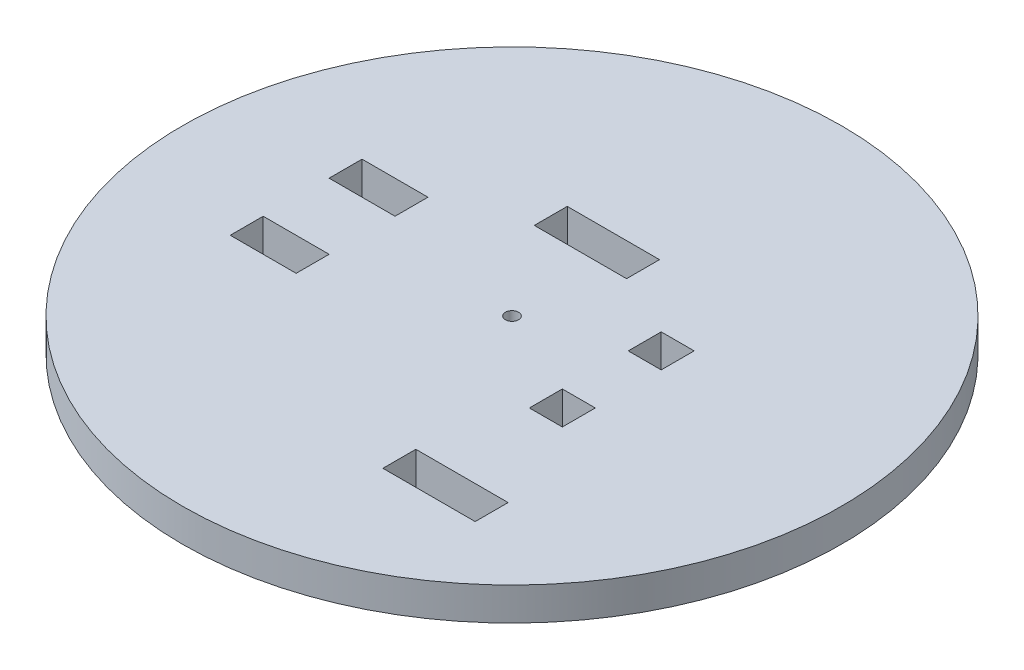
ISO-10303-21;
HEADER;
FILE_DESCRIPTION(('STEP AP214'),'2;1');
FILE_NAME('part.step','',(''),(''),'','','');
FILE_SCHEMA(('AUTOMOTIVE_DESIGN { 1 0 10303 214 1 1 1 1 }'));
ENDSEC;
DATA;
#1=APPLICATION_CONTEXT('core data for automotive mechanical design processes');
#2=APPLICATION_PROTOCOL_DEFINITION('international standard','automotive_design',2000,#1);
#3=PRODUCT_CONTEXT('',#1,'mechanical');
#4=PRODUCT('Part','Part','',(#3));
#5=PRODUCT_RELATED_PRODUCT_CATEGORY('part','',(#4));
#6=PRODUCT_DEFINITION_FORMATION('','',#4);
#7=PRODUCT_DEFINITION_CONTEXT('part definition',#1,'design');
#8=PRODUCT_DEFINITION('design','',#6,#7);
#9=PRODUCT_DEFINITION_SHAPE('','',#8);
#10=(LENGTH_UNIT() NAMED_UNIT(*) SI_UNIT(.MILLI.,.METRE.));
#11=(NAMED_UNIT(*) PLANE_ANGLE_UNIT() SI_UNIT($,.RADIAN.));
#12=(NAMED_UNIT(*) SI_UNIT($,.STERADIAN.) SOLID_ANGLE_UNIT());
#13=UNCERTAINTY_MEASURE_WITH_UNIT(LENGTH_MEASURE(1.E-05),#10,'distance_accuracy_value','');
#14=(GEOMETRIC_REPRESENTATION_CONTEXT(3) GLOBAL_UNCERTAINTY_ASSIGNED_CONTEXT((#13)) GLOBAL_UNIT_ASSIGNED_CONTEXT((#10,
#11,#12)) REPRESENTATION_CONTEXT('',''));
#15=CARTESIAN_POINT('',(0.,0.,0.));
#16=DIRECTION('',(0.,0.,1.));
#17=DIRECTION('',(1.,0.,0.));
#18=AXIS2_PLACEMENT_3D('',#15,#16,#17);
#19=CARTESIAN_POINT('',(-40.612799332742,6.35,0.));
#20=DIRECTION('',(-1.,0.,0.));
#21=DIRECTION('',(0.,0.,1.));
#22=AXIS2_PLACEMENT_3D('',#19,#20,#21);
#23=PLANE('',#22);
#24=DIRECTION('',(0.,0.,-1.));
#25=VECTOR('',#24,1.);
#26=CARTESIAN_POINT('',(-40.612799332742,0.,0.));
#27=LINE('',#26,#25);
#28=CARTESIAN_POINT('',(-40.612799332742,0.,13.6765770064407));
#29=VERTEX_POINT('',#28);
#30=CARTESIAN_POINT('',(-40.612799332742,0.,7.3265770064407));
#31=VERTEX_POINT('',#30);
#32=EDGE_CURVE('E292',#29,#31,#27,.T.);
#33=ORIENTED_EDGE('',*,*,#32,.T.);
#34=DIRECTION('',(0.,-1.,0.));
#35=VECTOR('',#34,1.);
#36=CARTESIAN_POINT('',(-40.612799332742,6.35,7.3265770064407));
#37=LINE('',#36,#35);
#38=CARTESIAN_POINT('',(-40.612799332742,6.35,7.3265770064407));
#39=VERTEX_POINT('',#38);
#40=EDGE_CURVE('E11',#39,#31,#37,.T.);
#41=ORIENTED_EDGE('',*,*,#40,.F.);
#42=DIRECTION('',(0.,0.,-1.));
#43=VECTOR('',#42,1.);
#44=CARTESIAN_POINT('',(-40.612799332742,6.35,0.));
#45=LINE('',#44,#43);
#46=CARTESIAN_POINT('',(-40.612799332742,6.35,13.6765770064407));
#47=VERTEX_POINT('',#46);
#48=EDGE_CURVE('E212',#47,#39,#45,.T.);
#49=ORIENTED_EDGE('',*,*,#48,.F.);
#50=DIRECTION('',(0.,-1.,0.));
#51=VECTOR('',#50,1.);
#52=CARTESIAN_POINT('',(-40.612799332742,6.35,13.6765770064407));
#53=LINE('',#52,#51);
#54=EDGE_CURVE('E54',#47,#29,#53,.T.);
#55=ORIENTED_EDGE('',*,*,#54,.T.);
#56=EDGE_LOOP('',(#33,#41,#49,#55));
#57=FACE_BOUND('',#56,.T.);
#58=ADVANCED_FACE('F35',(#57),#23,.F.);
#59=CARTESIAN_POINT('',(0.,6.35,7.3265770064407));
#60=DIRECTION('',(0.,0.,-1.));
#61=DIRECTION('',(-1.,0.,0.));
#62=AXIS2_PLACEMENT_3D('',#59,#60,#61);
#63=PLANE('',#62);
#64=DIRECTION('',(1.,0.,0.));
#65=VECTOR('',#64,1.);
#66=CARTESIAN_POINT('',(0.,0.,7.3265770064407));
#67=LINE('',#66,#65);
#68=CARTESIAN_POINT('',(-27.9127993327419,0.,7.3265770064407));
#69=VERTEX_POINT('',#68);
#70=EDGE_CURVE('E218',#31,#69,#67,.T.);
#71=ORIENTED_EDGE('',*,*,#70,.T.);
#72=DIRECTION('',(0.,-1.,0.));
#73=VECTOR('',#72,1.);
#74=CARTESIAN_POINT('',(-27.9127993327419,6.35,7.3265770064407));
#75=LINE('',#74,#73);
#76=CARTESIAN_POINT('',(-27.9127993327419,6.35,7.3265770064407));
#77=VERTEX_POINT('',#76);
#78=EDGE_CURVE('E45',#77,#69,#75,.T.);
#79=ORIENTED_EDGE('',*,*,#78,.F.);
#80=DIRECTION('',(1.,0.,0.));
#81=VECTOR('',#80,1.);
#82=CARTESIAN_POINT('',(0.,6.35,7.3265770064407));
#83=LINE('',#82,#81);
#84=EDGE_CURVE('E205',#39,#77,#83,.T.);
#85=ORIENTED_EDGE('',*,*,#84,.F.);
#86=ORIENTED_EDGE('',*,*,#40,.T.);
#87=EDGE_LOOP('',(#71,#79,#85,#86));
#88=FACE_BOUND('',#87,.T.);
#89=ADVANCED_FACE('F217',(#88),#63,.F.);
#90=CARTESIAN_POINT('',(-27.9127993327419,6.35,0.));
#91=DIRECTION('',(1.,0.,0.));
#92=DIRECTION('',(0.,0.,-1.));
#93=AXIS2_PLACEMENT_3D('',#90,#91,#92);
#94=PLANE('',#93);
#95=DIRECTION('',(0.,0.,1.));
#96=VECTOR('',#95,1.);
#97=CARTESIAN_POINT('',(-27.9127993327419,0.,0.));
#98=LINE('',#97,#96);
#99=CARTESIAN_POINT('',(-27.9127993327419,0.,13.6765770064407));
#100=VERTEX_POINT('',#99);
#101=EDGE_CURVE('E295',#69,#100,#98,.T.);
#102=ORIENTED_EDGE('',*,*,#101,.T.);
#103=DIRECTION('',(0.,-1.,0.));
#104=VECTOR('',#103,1.);
#105=CARTESIAN_POINT('',(-27.9127993327419,6.35,13.6765770064407));
#106=LINE('',#105,#104);
#107=CARTESIAN_POINT('',(-27.9127993327419,6.35,13.6765770064407));
#108=VERTEX_POINT('',#107);
#109=EDGE_CURVE('E129',#108,#100,#106,.T.);
#110=ORIENTED_EDGE('',*,*,#109,.F.);
#111=DIRECTION('',(0.,0.,1.));
#112=VECTOR('',#111,1.);
#113=CARTESIAN_POINT('',(-27.9127993327419,6.35,0.));
#114=LINE('',#113,#112);
#115=EDGE_CURVE('E211',#77,#108,#114,.T.);
#116=ORIENTED_EDGE('',*,*,#115,.F.);
#117=ORIENTED_EDGE('',*,*,#78,.T.);
#118=EDGE_LOOP('',(#102,#110,#116,#117));
#119=FACE_BOUND('',#118,.T.);
#120=ADVANCED_FACE('F222',(#119),#94,.F.);
#121=CARTESIAN_POINT('',(0.,6.35,-23.6123745140754));
#122=DIRECTION('',(0.,0.,-1.));
#123=DIRECTION('',(-1.,0.,0.));
#124=AXIS2_PLACEMENT_3D('',#121,#122,#123);
#125=PLANE('',#124);
#126=DIRECTION('',(1.,0.,0.));
#127=VECTOR('',#126,1.);
#128=CARTESIAN_POINT('',(0.,0.,-23.6123745140754));
#129=LINE('',#128,#127);
#130=CARTESIAN_POINT('',(-12.9663344216766,0.,-23.6123745140754));
#131=VERTEX_POINT('',#130);
#132=CARTESIAN_POINT('',(4.81366557832339,0.,-23.6123745140754));
#133=VERTEX_POINT('',#132);
#134=EDGE_CURVE('E280',#131,#133,#129,.T.);
#135=ORIENTED_EDGE('',*,*,#134,.T.);
#136=DIRECTION('',(0.,-1.,0.));
#137=VECTOR('',#136,1.);
#138=CARTESIAN_POINT('',(4.81366557832339,6.35,-23.6123745140754));
#139=LINE('',#138,#137);
#140=CARTESIAN_POINT('',(4.81366557832339,6.35,-23.6123745140754));
#141=VERTEX_POINT('',#140);
#142=EDGE_CURVE('E305',#141,#133,#139,.T.);
#143=ORIENTED_EDGE('',*,*,#142,.F.);
#144=DIRECTION('',(1.,0.,0.));
#145=VECTOR('',#144,1.);
#146=CARTESIAN_POINT('',(0.,6.35,-23.6123745140754));
#147=LINE('',#146,#145);
#148=CARTESIAN_POINT('',(-12.9663344216766,6.35,-23.6123745140754));
#149=VERTEX_POINT('',#148);
#150=EDGE_CURVE('E667',#149,#141,#147,.T.);
#151=ORIENTED_EDGE('',*,*,#150,.F.);
#152=DIRECTION('',(0.,-1.,0.));
#153=VECTOR('',#152,1.);
#154=CARTESIAN_POINT('',(-12.9663344216766,6.35,-23.6123745140754));
#155=LINE('',#154,#153);
#156=EDGE_CURVE('E307',#149,#131,#155,.T.);
#157=ORIENTED_EDGE('',*,*,#156,.T.);
#158=EDGE_LOOP('',(#135,#143,#151,#157));
#159=FACE_BOUND('',#158,.T.);
#160=ADVANCED_FACE('F400',(#159),#125,.F.);
#161=CARTESIAN_POINT('',(4.81366557832339,6.35,0.));
#162=DIRECTION('',(1.,0.,0.));
#163=DIRECTION('',(0.,0.,-1.));
#164=AXIS2_PLACEMENT_3D('',#161,#162,#163);
#165=PLANE('',#164);
#166=DIRECTION('',(0.,0.,1.));
#167=VECTOR('',#166,1.);
#168=CARTESIAN_POINT('',(4.81366557832339,0.,0.));
#169=LINE('',#168,#167);
#170=CARTESIAN_POINT('',(4.81366557832339,0.,-17.2623745140754));
#171=VERTEX_POINT('',#170);
#172=EDGE_CURVE('E283',#133,#171,#169,.T.);
#173=ORIENTED_EDGE('',*,*,#172,.T.);
#174=DIRECTION('',(0.,-1.,0.));
#175=VECTOR('',#174,1.);
#176=CARTESIAN_POINT('',(4.81366557832339,6.35,-17.2623745140754));
#177=LINE('',#176,#175);
#178=CARTESIAN_POINT('',(4.81366557832339,6.35,-17.2623745140754));
#179=VERTEX_POINT('',#178);
#180=EDGE_CURVE('E312',#179,#171,#177,.T.);
#181=ORIENTED_EDGE('',*,*,#180,.F.);
#182=DIRECTION('',(0.,0.,1.));
#183=VECTOR('',#182,1.);
#184=CARTESIAN_POINT('',(4.81366557832339,6.35,0.));
#185=LINE('',#184,#183);
#186=EDGE_CURVE('E670',#141,#179,#185,.T.);
#187=ORIENTED_EDGE('',*,*,#186,.F.);
#188=ORIENTED_EDGE('',*,*,#142,.T.);
#189=EDGE_LOOP('',(#173,#181,#187,#188));
#190=FACE_BOUND('',#189,.T.);
#191=ADVANCED_FACE('F396',(#190),#165,.F.);
#192=CARTESIAN_POINT('',(0.,6.35,-17.2623745140754));
#193=DIRECTION('',(0.,0.,-1.));
#194=DIRECTION('',(-1.,0.,0.));
#195=AXIS2_PLACEMENT_3D('',#192,#193,#194);
#196=PLANE('',#195);
#197=DIRECTION('',(1.,0.,0.));
#198=VECTOR('',#197,1.);
#199=CARTESIAN_POINT('',(0.,0.,-17.2623745140754));
#200=LINE('',#199,#198);
#201=CARTESIAN_POINT('',(-12.9663344216766,0.,-17.2623745140754));
#202=VERTEX_POINT('',#201);
#203=EDGE_CURVE('E286',#202,#171,#200,.T.);
#204=ORIENTED_EDGE('',*,*,#203,.F.);
#205=DIRECTION('',(0.,-1.,0.));
#206=VECTOR('',#205,1.);
#207=CARTESIAN_POINT('',(-12.9663344216766,6.35,-17.2623745140754));
#208=LINE('',#207,#206);
#209=CARTESIAN_POINT('',(-12.9663344216766,6.35,-17.2623745140754));
#210=VERTEX_POINT('',#209);
#211=EDGE_CURVE('E309',#210,#202,#208,.T.);
#212=ORIENTED_EDGE('',*,*,#211,.F.);
#213=DIRECTION('',(1.,0.,0.));
#214=VECTOR('',#213,1.);
#215=CARTESIAN_POINT('',(0.,6.35,-17.2623745140754));
#216=LINE('',#215,#214);
#217=EDGE_CURVE('E678',#210,#179,#216,.T.);
#218=ORIENTED_EDGE('',*,*,#217,.T.);
#219=ORIENTED_EDGE('',*,*,#180,.T.);
#220=EDGE_LOOP('',(#204,#212,#218,#219));
#221=FACE_BOUND('',#220,.T.);
#222=ADVANCED_FACE('F392',(#221),#196,.T.);
#223=CARTESIAN_POINT('',(0.,6.35,-11.7234229935593));
#224=DIRECTION('',(0.,0.,1.));
#225=DIRECTION('',(1.,0.,0.));
#226=AXIS2_PLACEMENT_3D('',#223,#224,#225);
#227=PLANE('',#226);
#228=DIRECTION('',(-1.,0.,0.));
#229=VECTOR('',#228,1.);
#230=CARTESIAN_POINT('',(0.,0.,-11.7234229935593));
#231=LINE('',#230,#229);
#232=CARTESIAN_POINT('',(23.3754891704784,0.,-11.7234229935593));
#233=VERTEX_POINT('',#232);
#234=CARTESIAN_POINT('',(17.0254891704784,0.,-11.7234229935593));
#235=VERTEX_POINT('',#234);
#236=EDGE_CURVE('E268',#233,#235,#231,.T.);
#237=ORIENTED_EDGE('',*,*,#236,.F.);
#238=DIRECTION('',(0.,-1.,0.));
#239=VECTOR('',#238,1.);
#240=CARTESIAN_POINT('',(23.3754891704784,6.35,-11.7234229935593));
#241=LINE('',#240,#239);
#242=CARTESIAN_POINT('',(23.3754891704784,6.35,-11.7234229935593));
#243=VERTEX_POINT('',#242);
#244=EDGE_CURVE('E310',#243,#233,#241,.T.);
#245=ORIENTED_EDGE('',*,*,#244,.F.);
#246=DIRECTION('',(-1.,0.,0.));
#247=VECTOR('',#246,1.);
#248=CARTESIAN_POINT('',(0.,6.35,-11.7234229935593));
#249=LINE('',#248,#247);
#250=CARTESIAN_POINT('',(17.0254891704784,6.35,-11.7234229935593));
#251=VERTEX_POINT('',#250);
#252=EDGE_CURVE('E663',#243,#251,#249,.T.);
#253=ORIENTED_EDGE('',*,*,#252,.T.);
#254=DIRECTION('',(0.,-1.,0.));
#255=VECTOR('',#254,1.);
#256=CARTESIAN_POINT('',(17.0254891704784,6.35,-11.7234229935593));
#257=LINE('',#256,#255);
#258=EDGE_CURVE('E316',#251,#235,#257,.T.);
#259=ORIENTED_EDGE('',*,*,#258,.T.);
#260=EDGE_LOOP('',(#237,#245,#253,#259));
#261=FACE_BOUND('',#260,.T.);
#262=ADVANCED_FACE('F395',(#261),#227,.T.);
#263=CARTESIAN_POINT('',(23.3754891704784,6.35,0.));
#264=DIRECTION('',(1.,0.,0.));
#265=DIRECTION('',(0.,0.,-1.));
#266=AXIS2_PLACEMENT_3D('',#263,#264,#265);
#267=PLANE('',#266);
#268=DIRECTION('',(0.,0.,1.));
#269=VECTOR('',#268,1.);
#270=CARTESIAN_POINT('',(23.3754891704784,0.,0.));
#271=LINE('',#270,#269);
#272=CARTESIAN_POINT('',(23.3754891704784,0.,-5.3734229935593));
#273=VERTEX_POINT('',#272);
#274=EDGE_CURVE('E271',#233,#273,#271,.T.);
#275=ORIENTED_EDGE('',*,*,#274,.T.);
#276=DIRECTION('',(0.,-1.,0.));
#277=VECTOR('',#276,1.);
#278=CARTESIAN_POINT('',(23.3754891704784,6.35,-5.3734229935593));
#279=LINE('',#278,#277);
#280=CARTESIAN_POINT('',(23.3754891704784,6.35,-5.3734229935593));
#281=VERTEX_POINT('',#280);
#282=EDGE_CURVE('E322',#281,#273,#279,.T.);
#283=ORIENTED_EDGE('',*,*,#282,.F.);
#284=DIRECTION('',(0.,0.,1.));
#285=VECTOR('',#284,1.);
#286=CARTESIAN_POINT('',(23.3754891704784,6.35,0.));
#287=LINE('',#286,#285);
#288=EDGE_CURVE('E694',#243,#281,#287,.T.);
#289=ORIENTED_EDGE('',*,*,#288,.F.);
#290=ORIENTED_EDGE('',*,*,#244,.T.);
#291=EDGE_LOOP('',(#275,#283,#289,#290));
#292=FACE_BOUND('',#291,.T.);
#293=ADVANCED_FACE('F413',(#292),#267,.F.);
#294=CARTESIAN_POINT('',(0.,6.35,-5.37342299355929));
#295=DIRECTION('',(0.,0.,1.));
#296=DIRECTION('',(1.,0.,0.));
#297=AXIS2_PLACEMENT_3D('',#294,#295,#296);
#298=PLANE('',#297);
#299=DIRECTION('',(-1.,0.,0.));
#300=VECTOR('',#299,1.);
#301=CARTESIAN_POINT('',(0.,0.,-5.37342299355929));
#302=LINE('',#301,#300);
#303=CARTESIAN_POINT('',(17.0254891704784,0.,-5.37342299355929));
#304=VERTEX_POINT('',#303);
#305=EDGE_CURVE('E274',#273,#304,#302,.T.);
#306=ORIENTED_EDGE('',*,*,#305,.T.);
#307=DIRECTION('',(0.,-1.,0.));
#308=VECTOR('',#307,1.);
#309=CARTESIAN_POINT('',(17.0254891704784,6.35,-5.37342299355929));
#310=LINE('',#309,#308);
#311=CARTESIAN_POINT('',(17.0254891704784,6.35,-5.37342299355929));
#312=VERTEX_POINT('',#311);
#313=EDGE_CURVE('E318',#312,#304,#310,.T.);
#314=ORIENTED_EDGE('',*,*,#313,.F.);
#315=DIRECTION('',(-1.,0.,0.));
#316=VECTOR('',#315,1.);
#317=CARTESIAN_POINT('',(0.,6.35,-5.37342299355929));
#318=LINE('',#317,#316);
#319=EDGE_CURVE('E691',#281,#312,#318,.T.);
#320=ORIENTED_EDGE('',*,*,#319,.F.);
#321=ORIENTED_EDGE('',*,*,#282,.T.);
#322=EDGE_LOOP('',(#306,#314,#320,#321));
#323=FACE_BOUND('',#322,.T.);
#324=ADVANCED_FACE('F409',(#323),#298,.F.);
#325=CARTESIAN_POINT('',(0.,6.35,7.32657700644071));
#326=DIRECTION('',(0.,0.,-1.));
#327=DIRECTION('',(-1.,0.,0.));
#328=AXIS2_PLACEMENT_3D('',#325,#326,#327);
#329=PLANE('',#328);
#330=DIRECTION('',(1.,0.,0.));
#331=VECTOR('',#330,1.);
#332=CARTESIAN_POINT('',(0.,0.,7.32657700644071));
#333=LINE('',#332,#331);
#334=CARTESIAN_POINT('',(17.0254891704784,0.,7.3265770064407));
#335=VERTEX_POINT('',#334);
#336=CARTESIAN_POINT('',(23.3754891704784,0.,7.3265770064407));
#337=VERTEX_POINT('',#336);
#338=EDGE_CURVE('E259',#335,#337,#333,.T.);
#339=ORIENTED_EDGE('',*,*,#338,.T.);
#340=DIRECTION('',(0.,-1.,0.));
#341=VECTOR('',#340,1.);
#342=CARTESIAN_POINT('',(23.3754891704784,6.35,7.3265770064407));
#343=LINE('',#342,#341);
#344=CARTESIAN_POINT('',(23.3754891704784,6.35,7.3265770064407));
#345=VERTEX_POINT('',#344);
#346=EDGE_CURVE('E319',#345,#337,#343,.T.);
#347=ORIENTED_EDGE('',*,*,#346,.F.);
#348=DIRECTION('',(1.,0.,0.));
#349=VECTOR('',#348,1.);
#350=CARTESIAN_POINT('',(0.,6.35,7.32657700644071));
#351=LINE('',#350,#349);
#352=CARTESIAN_POINT('',(17.0254891704784,6.35,7.3265770064407));
#353=VERTEX_POINT('',#352);
#354=EDGE_CURVE('E657',#353,#345,#351,.T.);
#355=ORIENTED_EDGE('',*,*,#354,.F.);
#356=DIRECTION('',(0.,-1.,0.));
#357=VECTOR('',#356,1.);
#358=CARTESIAN_POINT('',(17.0254891704784,6.35,7.3265770064407));
#359=LINE('',#358,#357);
#360=EDGE_CURVE('E326',#353,#335,#359,.T.);
#361=ORIENTED_EDGE('',*,*,#360,.T.);
#362=EDGE_LOOP('',(#339,#347,#355,#361));
#363=FACE_BOUND('',#362,.T.);
#364=ADVANCED_FACE('F412',(#363),#329,.F.);
#365=CARTESIAN_POINT('',(23.3754891704784,6.35,0.));
#366=DIRECTION('',(1.,0.,0.));
#367=DIRECTION('',(0.,0.,-1.));
#368=AXIS2_PLACEMENT_3D('',#365,#366,#367);
#369=PLANE('',#368);
#370=DIRECTION('',(0.,0.,1.));
#371=VECTOR('',#370,1.);
#372=CARTESIAN_POINT('',(23.3754891704784,0.,0.));
#373=LINE('',#372,#371);
#374=CARTESIAN_POINT('',(23.3754891704784,0.,13.6765770064407));
#375=VERTEX_POINT('',#374);
#376=EDGE_CURVE('E262',#337,#375,#373,.T.);
#377=ORIENTED_EDGE('',*,*,#376,.T.);
#378=DIRECTION('',(0.,-1.,0.));
#379=VECTOR('',#378,1.);
#380=CARTESIAN_POINT('',(23.3754891704784,6.35,13.6765770064407));
#381=LINE('',#380,#379);
#382=CARTESIAN_POINT('',(23.3754891704784,6.35,13.6765770064407));
#383=VERTEX_POINT('',#382);
#384=EDGE_CURVE('E333',#383,#375,#381,.T.);
#385=ORIENTED_EDGE('',*,*,#384,.F.);
#386=DIRECTION('',(0.,0.,1.));
#387=VECTOR('',#386,1.);
#388=CARTESIAN_POINT('',(23.3754891704784,6.35,0.));
#389=LINE('',#388,#387);
#390=EDGE_CURVE('E701',#345,#383,#389,.T.);
#391=ORIENTED_EDGE('',*,*,#390,.F.);
#392=ORIENTED_EDGE('',*,*,#346,.T.);
#393=EDGE_LOOP('',(#377,#385,#391,#392));
#394=FACE_BOUND('',#393,.T.);
#395=ADVANCED_FACE('F429',(#394),#369,.F.);
#396=CARTESIAN_POINT('',(0.,6.35,13.6765770064407));
#397=DIRECTION('',(0.,0.,1.));
#398=DIRECTION('',(1.,0.,0.));
#399=AXIS2_PLACEMENT_3D('',#396,#397,#398);
#400=PLANE('',#399);
#401=DIRECTION('',(-1.,0.,0.));
#402=VECTOR('',#401,1.);
#403=CARTESIAN_POINT('',(0.,0.,13.6765770064407));
#404=LINE('',#403,#402);
#405=CARTESIAN_POINT('',(17.0254891704784,0.,13.6765770064407));
#406=VERTEX_POINT('',#405);
#407=EDGE_CURVE('E264',#375,#406,#404,.T.);
#408=ORIENTED_EDGE('',*,*,#407,.T.);
#409=DIRECTION('',(0.,-1.,0.));
#410=VECTOR('',#409,1.);
#411=CARTESIAN_POINT('',(17.0254891704784,6.35,13.6765770064407));
#412=LINE('',#411,#410);
#413=CARTESIAN_POINT('',(17.0254891704784,6.35,13.6765770064407));
#414=VERTEX_POINT('',#413);
#415=EDGE_CURVE('E329',#414,#406,#412,.T.);
#416=ORIENTED_EDGE('',*,*,#415,.F.);
#417=DIRECTION('',(-1.,0.,0.));
#418=VECTOR('',#417,1.);
#419=CARTESIAN_POINT('',(0.,6.35,13.6765770064407));
#420=LINE('',#419,#418);
#421=EDGE_CURVE('E699',#383,#414,#420,.T.);
#422=ORIENTED_EDGE('',*,*,#421,.F.);
#423=ORIENTED_EDGE('',*,*,#384,.T.);
#424=EDGE_LOOP('',(#408,#416,#422,#423));
#425=FACE_BOUND('',#424,.T.);
#426=ADVANCED_FACE('F425',(#425),#400,.F.);
#427=CARTESIAN_POINT('',(0.,6.35,31.5071999492863));
#428=DIRECTION('',(0.,0.,-1.));
#429=DIRECTION('',(-1.,0.,0.));
#430=AXIS2_PLACEMENT_3D('',#427,#428,#429);
#431=PLANE('',#430);
#432=DIRECTION('',(1.,0.,0.));
#433=VECTOR('',#432,1.);
#434=CARTESIAN_POINT('',(0.,0.,31.5071999492863));
#435=LINE('',#434,#433);
#436=CARTESIAN_POINT('',(12.9806274029818,0.,31.5071999492863));
#437=VERTEX_POINT('',#436);
#438=CARTESIAN_POINT('',(30.7606274029818,0.,31.5071999492863));
#439=VERTEX_POINT('',#438);
#440=EDGE_CURVE('E247',#437,#439,#435,.T.);
#441=ORIENTED_EDGE('',*,*,#440,.T.);
#442=DIRECTION('',(0.,-1.,0.));
#443=VECTOR('',#442,1.);
#444=CARTESIAN_POINT('',(30.7606274029818,6.35,31.5071999492863));
#445=LINE('',#444,#443);
#446=CARTESIAN_POINT('',(30.7606274029818,6.35,31.5071999492863));
#447=VERTEX_POINT('',#446);
#448=EDGE_CURVE('E330',#447,#439,#445,.T.);
#449=ORIENTED_EDGE('',*,*,#448,.F.);
#450=DIRECTION('',(1.,0.,0.));
#451=VECTOR('',#450,1.);
#452=CARTESIAN_POINT('',(0.,6.35,31.5071999492863));
#453=LINE('',#452,#451);
#454=CARTESIAN_POINT('',(12.9806274029818,6.35,31.5071999492863));
#455=VERTEX_POINT('',#454);
#456=EDGE_CURVE('E652',#455,#447,#453,.T.);
#457=ORIENTED_EDGE('',*,*,#456,.F.);
#458=DIRECTION('',(0.,-1.,0.));
#459=VECTOR('',#458,1.);
#460=CARTESIAN_POINT('',(12.9806274029818,6.35,31.5071999492863));
#461=LINE('',#460,#459);
#462=EDGE_CURVE('E338',#455,#437,#461,.T.);
#463=ORIENTED_EDGE('',*,*,#462,.T.);
#464=EDGE_LOOP('',(#441,#449,#457,#463));
#465=FACE_BOUND('',#464,.T.);
#466=ADVANCED_FACE('F428',(#465),#431,.F.);
#467=CARTESIAN_POINT('',(30.7606274029818,6.35,0.));
#468=DIRECTION('',(1.,0.,0.));
#469=DIRECTION('',(0.,0.,-1.));
#470=AXIS2_PLACEMENT_3D('',#467,#468,#469);
#471=PLANE('',#470);
#472=DIRECTION('',(0.,0.,1.));
#473=VECTOR('',#472,1.);
#474=CARTESIAN_POINT('',(30.7606274029818,0.,0.));
#475=LINE('',#474,#473);
#476=CARTESIAN_POINT('',(30.7606274029818,0.,37.8571999492863));
#477=VERTEX_POINT('',#476);
#478=EDGE_CURVE('E250',#439,#477,#475,.T.);
#479=ORIENTED_EDGE('',*,*,#478,.T.);
#480=DIRECTION('',(0.,-1.,0.));
#481=VECTOR('',#480,1.);
#482=CARTESIAN_POINT('',(30.7606274029818,6.35,37.8571999492863));
#483=LINE('',#482,#481);
#484=CARTESIAN_POINT('',(30.7606274029818,6.35,37.8571999492863));
#485=VERTEX_POINT('',#484);
#486=EDGE_CURVE('E342',#485,#477,#483,.T.);
#487=ORIENTED_EDGE('',*,*,#486,.F.);
#488=DIRECTION('',(0.,0.,1.));
#489=VECTOR('',#488,1.);
#490=CARTESIAN_POINT('',(30.7606274029818,6.35,0.));
#491=LINE('',#490,#489);
#492=EDGE_CURVE('E710',#447,#485,#491,.T.);
#493=ORIENTED_EDGE('',*,*,#492,.F.);
#494=ORIENTED_EDGE('',*,*,#448,.T.);
#495=EDGE_LOOP('',(#479,#487,#493,#494));
#496=FACE_BOUND('',#495,.T.);
#497=ADVANCED_FACE('F443',(#496),#471,.F.);
#498=CARTESIAN_POINT('',(0.,6.35,37.8571999492863));
#499=DIRECTION('',(0.,0.,-1.));
#500=DIRECTION('',(-1.,0.,0.));
#501=AXIS2_PLACEMENT_3D('',#498,#499,#500);
#502=PLANE('',#501);
#503=DIRECTION('',(1.,0.,0.));
#504=VECTOR('',#503,1.);
#505=CARTESIAN_POINT('',(0.,0.,37.8571999492863));
#506=LINE('',#505,#504);
#507=CARTESIAN_POINT('',(12.9806274029818,0.,37.8571999492863));
#508=VERTEX_POINT('',#507);
#509=EDGE_CURVE('E253',#508,#477,#506,.T.);
#510=ORIENTED_EDGE('',*,*,#509,.F.);
#511=DIRECTION('',(0.,-1.,0.));
#512=VECTOR('',#511,1.);
#513=CARTESIAN_POINT('',(12.9806274029818,6.35,37.8571999492863));
#514=LINE('',#513,#512);
#515=CARTESIAN_POINT('',(12.9806274029818,6.35,37.8571999492863));
#516=VERTEX_POINT('',#515);
#517=EDGE_CURVE('E340',#516,#508,#514,.T.);
#518=ORIENTED_EDGE('',*,*,#517,.F.);
#519=DIRECTION('',(1.,0.,0.));
#520=VECTOR('',#519,1.);
#521=CARTESIAN_POINT('',(0.,6.35,37.8571999492863));
#522=LINE('',#521,#520);
#523=EDGE_CURVE('E707',#516,#485,#522,.T.);
#524=ORIENTED_EDGE('',*,*,#523,.T.);
#525=ORIENTED_EDGE('',*,*,#486,.T.);
#526=EDGE_LOOP('',(#510,#518,#524,#525));
#527=FACE_BOUND('',#526,.T.);
#528=ADVANCED_FACE('F440',(#527),#502,.T.);
#529=CARTESIAN_POINT('',(-40.612799332742,6.35,0.));
#530=DIRECTION('',(-1.,0.,0.));
#531=DIRECTION('',(0.,0.,1.));
#532=AXIS2_PLACEMENT_3D('',#529,#530,#531);
#533=PLANE('',#532);
#534=DIRECTION('',(0.,0.,-1.));
#535=VECTOR('',#534,1.);
#536=CARTESIAN_POINT('',(-40.612799332742,0.,0.));
#537=LINE('',#536,#535);
#538=CARTESIAN_POINT('',(-40.612799332742,0.,-5.37342299355929));
#539=VERTEX_POINT('',#538);
#540=CARTESIAN_POINT('',(-40.612799332742,0.,-11.7234229935593));
#541=VERTEX_POINT('',#540);
#542=EDGE_CURVE('E235',#539,#541,#537,.T.);
#543=ORIENTED_EDGE('',*,*,#542,.T.);
#544=DIRECTION('',(0.,-1.,0.));
#545=VECTOR('',#544,1.);
#546=CARTESIAN_POINT('',(-40.612799332742,6.35,-11.7234229935593));
#547=LINE('',#546,#545);
#548=CARTESIAN_POINT('',(-40.612799332742,6.35,-11.7234229935593));
#549=VERTEX_POINT('',#548);
#550=EDGE_CURVE('E39',#549,#541,#547,.T.);
#551=ORIENTED_EDGE('',*,*,#550,.F.);
#552=DIRECTION('',(0.,0.,-1.));
#553=VECTOR('',#552,1.);
#554=CARTESIAN_POINT('',(-40.612799332742,6.35,0.));
#555=LINE('',#554,#553);
#556=CARTESIAN_POINT('',(-40.612799332742,6.35,-5.37342299355929));
#557=VERTEX_POINT('',#556);
#558=EDGE_CURVE('E647',#557,#549,#555,.T.);
#559=ORIENTED_EDGE('',*,*,#558,.F.);
#560=DIRECTION('',(0.,-1.,0.));
#561=VECTOR('',#560,1.);
#562=CARTESIAN_POINT('',(-40.612799332742,6.35,-5.37342299355929));
#563=LINE('',#562,#561);
#564=EDGE_CURVE('E231',#557,#539,#563,.T.);
#565=ORIENTED_EDGE('',*,*,#564,.T.);
#566=EDGE_LOOP('',(#543,#551,#559,#565));
#567=FACE_BOUND('',#566,.T.);
#568=ADVANCED_FACE('F357',(#567),#533,.F.);
#569=CARTESIAN_POINT('',(0.,6.35,-11.7234229935593));
#570=DIRECTION('',(0.,0.,-1.));
#571=DIRECTION('',(-1.,0.,0.));
#572=AXIS2_PLACEMENT_3D('',#569,#570,#571);
#573=PLANE('',#572);
#574=DIRECTION('',(1.,0.,0.));
#575=VECTOR('',#574,1.);
#576=CARTESIAN_POINT('',(0.,0.,-11.7234229935593));
#577=LINE('',#576,#575);
#578=CARTESIAN_POINT('',(-27.9127993327419,0.,-11.7234229935593));
#579=VERTEX_POINT('',#578);
#580=EDGE_CURVE('E238',#541,#579,#577,.T.);
#581=ORIENTED_EDGE('',*,*,#580,.T.);
#582=DIRECTION('',(0.,-1.,0.));
#583=VECTOR('',#582,1.);
#584=CARTESIAN_POINT('',(-27.9127993327419,6.35,-11.7234229935593));
#585=LINE('',#584,#583);
#586=CARTESIAN_POINT('',(-27.9127993327419,6.35,-11.7234229935593));
#587=VERTEX_POINT('',#586);
#588=EDGE_CURVE('E348',#587,#579,#585,.T.);
#589=ORIENTED_EDGE('',*,*,#588,.F.);
#590=DIRECTION('',(1.,0.,0.));
#591=VECTOR('',#590,1.);
#592=CARTESIAN_POINT('',(0.,6.35,-11.7234229935593));
#593=LINE('',#592,#591);
#594=EDGE_CURVE('E142',#549,#587,#593,.T.);
#595=ORIENTED_EDGE('',*,*,#594,.F.);
#596=ORIENTED_EDGE('',*,*,#550,.T.);
#597=EDGE_LOOP('',(#581,#589,#595,#596));
#598=FACE_BOUND('',#597,.T.);
#599=ADVANCED_FACE('F353',(#598),#573,.F.);
#600=CARTESIAN_POINT('',(-27.9127993327419,6.35,0.));
#601=DIRECTION('',(-1.,0.,0.));
#602=DIRECTION('',(0.,0.,1.));
#603=AXIS2_PLACEMENT_3D('',#600,#601,#602);
#604=PLANE('',#603);
#605=DIRECTION('',(0.,0.,-1.));
#606=VECTOR('',#605,1.);
#607=CARTESIAN_POINT('',(-27.9127993327419,0.,0.));
#608=LINE('',#607,#606);
#609=CARTESIAN_POINT('',(-27.9127993327419,0.,-5.37342299355929));
#610=VERTEX_POINT('',#609);
#611=EDGE_CURVE('E241',#610,#579,#608,.T.);
#612=ORIENTED_EDGE('',*,*,#611,.F.);
#613=DIRECTION('',(0.,-1.,0.));
#614=VECTOR('',#613,1.);
#615=CARTESIAN_POINT('',(-27.9127993327419,6.35,-5.37342299355929));
#616=LINE('',#615,#614);
#617=CARTESIAN_POINT('',(-27.9127993327419,6.35,-5.37342299355929));
#618=VERTEX_POINT('',#617);
#619=EDGE_CURVE('E347',#618,#610,#616,.T.);
#620=ORIENTED_EDGE('',*,*,#619,.F.);
#621=DIRECTION('',(0.,0.,-1.));
#622=VECTOR('',#621,1.);
#623=CARTESIAN_POINT('',(-27.9127993327419,6.35,0.));
#624=LINE('',#623,#622);
#625=EDGE_CURVE('E714',#618,#587,#624,.T.);
#626=ORIENTED_EDGE('',*,*,#625,.T.);
#627=ORIENTED_EDGE('',*,*,#588,.T.);
#628=EDGE_LOOP('',(#612,#620,#626,#627));
#629=FACE_BOUND('',#628,.T.);
#630=ADVANCED_FACE('F368',(#629),#604,.T.);
#631=CARTESIAN_POINT('',(0.,6.35,13.6765770064407));
#632=DIRECTION('',(0.,0.,-1.));
#633=DIRECTION('',(-1.,0.,0.));
#634=AXIS2_PLACEMENT_3D('',#631,#632,#633);
#635=PLANE('',#634);
#636=DIRECTION('',(1.,0.,0.));
#637=VECTOR('',#636,1.);
#638=CARTESIAN_POINT('',(0.,0.,13.6765770064407));
#639=LINE('',#638,#637);
#640=EDGE_CURVE('E297',#29,#100,#639,.T.);
#641=ORIENTED_EDGE('',*,*,#640,.F.);
#642=ORIENTED_EDGE('',*,*,#54,.F.);
#643=DIRECTION('',(1.,0.,0.));
#644=VECTOR('',#643,1.);
#645=CARTESIAN_POINT('',(0.,6.35,13.6765770064407));
#646=LINE('',#645,#644);
#647=EDGE_CURVE('E223',#47,#108,#646,.T.);
#648=ORIENTED_EDGE('',*,*,#647,.T.);
#649=ORIENTED_EDGE('',*,*,#109,.T.);
#650=EDGE_LOOP('',(#641,#642,#648,#649));
#651=FACE_BOUND('',#650,.T.);
#652=ADVANCED_FACE('F370',(#651),#635,.T.);
#653=CARTESIAN_POINT('',(-12.9663344216766,6.35,0.));
#654=DIRECTION('',(1.,0.,0.));
#655=DIRECTION('',(0.,0.,-1.));
#656=AXIS2_PLACEMENT_3D('',#653,#654,#655);
#657=PLANE('',#656);
#658=DIRECTION('',(0.,0.,1.));
#659=VECTOR('',#658,1.);
#660=CARTESIAN_POINT('',(-12.9663344216766,0.,0.));
#661=LINE('',#660,#659);
#662=EDGE_CURVE('E289',#131,#202,#661,.T.);
#663=ORIENTED_EDGE('',*,*,#662,.F.);
#664=ORIENTED_EDGE('',*,*,#156,.F.);
#665=DIRECTION('',(0.,0.,1.));
#666=VECTOR('',#665,1.);
#667=CARTESIAN_POINT('',(-12.9663344216766,6.35,0.));
#668=LINE('',#667,#666);
#669=EDGE_CURVE('E673',#149,#210,#668,.T.);
#670=ORIENTED_EDGE('',*,*,#669,.T.);
#671=ORIENTED_EDGE('',*,*,#211,.T.);
#672=EDGE_LOOP('',(#663,#664,#670,#671));
#673=FACE_BOUND('',#672,.T.);
#674=ADVANCED_FACE('F376',(#673),#657,.T.);
#675=CARTESIAN_POINT('',(17.0254891704784,6.35,0.));
#676=DIRECTION('',(-1.,0.,0.));
#677=DIRECTION('',(0.,0.,1.));
#678=AXIS2_PLACEMENT_3D('',#675,#676,#677);
#679=PLANE('',#678);
#680=DIRECTION('',(0.,0.,-1.));
#681=VECTOR('',#680,1.);
#682=CARTESIAN_POINT('',(17.0254891704784,0.,0.));
#683=LINE('',#682,#681);
#684=EDGE_CURVE('E277',#304,#235,#683,.T.);
#685=ORIENTED_EDGE('',*,*,#684,.T.);
#686=ORIENTED_EDGE('',*,*,#258,.F.);
#687=DIRECTION('',(0.,0.,-1.));
#688=VECTOR('',#687,1.);
#689=CARTESIAN_POINT('',(17.0254891704784,6.35,0.));
#690=LINE('',#689,#688);
#691=EDGE_CURVE('E674',#312,#251,#690,.T.);
#692=ORIENTED_EDGE('',*,*,#691,.F.);
#693=ORIENTED_EDGE('',*,*,#313,.T.);
#694=EDGE_LOOP('',(#685,#686,#692,#693));
#695=FACE_BOUND('',#694,.T.);
#696=ADVANCED_FACE('F390',(#695),#679,.F.);
#697=CARTESIAN_POINT('',(17.0254891704784,6.35,0.));
#698=DIRECTION('',(-1.,0.,0.));
#699=DIRECTION('',(0.,0.,1.));
#700=AXIS2_PLACEMENT_3D('',#697,#698,#699);
#701=PLANE('',#700);
#702=DIRECTION('',(0.,0.,-1.));
#703=VECTOR('',#702,1.);
#704=CARTESIAN_POINT('',(17.0254891704784,0.,0.));
#705=LINE('',#704,#703);
#706=EDGE_CURVE('E266',#406,#335,#705,.T.);
#707=ORIENTED_EDGE('',*,*,#706,.T.);
#708=ORIENTED_EDGE('',*,*,#360,.F.);
#709=DIRECTION('',(0.,0.,-1.));
#710=VECTOR('',#709,1.);
#711=CARTESIAN_POINT('',(17.0254891704784,6.35,0.));
#712=LINE('',#711,#710);
#713=EDGE_CURVE('E697',#414,#353,#712,.T.);
#714=ORIENTED_EDGE('',*,*,#713,.F.);
#715=ORIENTED_EDGE('',*,*,#415,.T.);
#716=EDGE_LOOP('',(#707,#708,#714,#715));
#717=FACE_BOUND('',#716,.T.);
#718=ADVANCED_FACE('F407',(#717),#701,.F.);
#719=CARTESIAN_POINT('',(12.9806274029818,6.35,0.));
#720=DIRECTION('',(1.,0.,0.));
#721=DIRECTION('',(0.,0.,-1.));
#722=AXIS2_PLACEMENT_3D('',#719,#720,#721);
#723=PLANE('',#722);
#724=DIRECTION('',(0.,0.,1.));
#725=VECTOR('',#724,1.);
#726=CARTESIAN_POINT('',(12.9806274029818,0.,0.));
#727=LINE('',#726,#725);
#728=EDGE_CURVE('E256',#437,#508,#727,.T.);
#729=ORIENTED_EDGE('',*,*,#728,.F.);
#730=ORIENTED_EDGE('',*,*,#462,.F.);
#731=DIRECTION('',(0.,0.,1.));
#732=VECTOR('',#731,1.);
#733=CARTESIAN_POINT('',(12.9806274029818,6.35,0.));
#734=LINE('',#733,#732);
#735=EDGE_CURVE('E704',#455,#516,#734,.T.);
#736=ORIENTED_EDGE('',*,*,#735,.T.);
#737=ORIENTED_EDGE('',*,*,#517,.T.);
#738=EDGE_LOOP('',(#729,#730,#736,#737));
#739=FACE_BOUND('',#738,.T.);
#740=ADVANCED_FACE('F423',(#739),#723,.T.);
#741=CARTESIAN_POINT('',(0.,6.35,-5.37342299355929));
#742=DIRECTION('',(0.,0.,-1.));
#743=DIRECTION('',(-1.,0.,0.));
#744=AXIS2_PLACEMENT_3D('',#741,#742,#743);
#745=PLANE('',#744);
#746=DIRECTION('',(1.,0.,0.));
#747=VECTOR('',#746,1.);
#748=CARTESIAN_POINT('',(0.,0.,-5.37342299355929));
#749=LINE('',#748,#747);
#750=EDGE_CURVE('E244',#539,#610,#749,.T.);
#751=ORIENTED_EDGE('',*,*,#750,.F.);
#752=ORIENTED_EDGE('',*,*,#564,.F.);
#753=DIRECTION('',(1.,0.,0.));
#754=VECTOR('',#753,1.);
#755=CARTESIAN_POINT('',(0.,6.35,-5.37342299355929));
#756=LINE('',#755,#754);
#757=EDGE_CURVE('E366',#557,#618,#756,.T.);
#758=ORIENTED_EDGE('',*,*,#757,.T.);
#759=ORIENTED_EDGE('',*,*,#619,.T.);
#760=EDGE_LOOP('',(#751,#752,#758,#759));
#761=FACE_BOUND('',#760,.T.);
#762=ADVANCED_FACE('F363',(#761),#745,.T.);
#763=CARTESIAN_POINT('',(0.,6.35,0.));
#764=DIRECTION('',(0.,-1.,0.));
#765=DIRECTION('',(0.,0.,-1.));
#766=AXIS2_PLACEMENT_3D('',#763,#764,#765);
#767=CYLINDRICAL_SURFACE('',#766,1.27);
#768=CARTESIAN_POINT('',(0.,6.35,0.));
#769=DIRECTION('',(0.,1.,0.));
#770=DIRECTION('',(0.,0.,1.));
#771=AXIS2_PLACEMENT_3D('',#768,#769,#770);
#772=CIRCLE('',#771,1.27);
#773=CARTESIAN_POINT('',(0.,6.35,1.27));
#774=VERTEX_POINT('',#773);
#775=EDGE_CURVE('E303',#774,#774,#772,.T.);
#776=ORIENTED_EDGE('',*,*,#775,.T.);
#777=EDGE_LOOP('',(#776));
#778=FACE_BOUND('',#777,.T.);
#779=CARTESIAN_POINT('',(0.,0.,0.));
#780=DIRECTION('',(0.,1.,0.));
#781=DIRECTION('',(0.,0.,1.));
#782=AXIS2_PLACEMENT_3D('',#779,#780,#781);
#783=CIRCLE('',#782,1.27);
#784=CARTESIAN_POINT('',(0.,0.,1.27));
#785=VERTEX_POINT('',#784);
#786=EDGE_CURVE('E232',#785,#785,#783,.T.);
#787=ORIENTED_EDGE('',*,*,#786,.F.);
#788=EDGE_LOOP('',(#787));
#789=FACE_BOUND('',#788,.T.);
#790=ADVANCED_FACE('F37',(#778,#789),#767,.F.);
#791=CARTESIAN_POINT('',(0.,6.35,0.));
#792=DIRECTION('',(0.,-1.,0.));
#793=DIRECTION('',(0.,0.,-1.));
#794=AXIS2_PLACEMENT_3D('',#791,#792,#793);
#795=CYLINDRICAL_SURFACE('',#794,63.5);
#796=CARTESIAN_POINT('',(0.,6.35,0.));
#797=DIRECTION('',(0.,1.,0.));
#798=DIRECTION('',(0.,0.,1.));
#799=AXIS2_PLACEMENT_3D('',#796,#797,#798);
#800=CIRCLE('',#799,63.5);
#801=CARTESIAN_POINT('',(0.,6.35,63.5));
#802=VERTEX_POINT('',#801);
#803=EDGE_CURVE('E225',#802,#802,#800,.T.);
#804=ORIENTED_EDGE('',*,*,#803,.F.);
#805=EDGE_LOOP('',(#804));
#806=FACE_BOUND('',#805,.T.);
#807=CARTESIAN_POINT('',(0.,0.,0.));
#808=DIRECTION('',(0.,1.,0.));
#809=DIRECTION('',(0.,0.,1.));
#810=AXIS2_PLACEMENT_3D('',#807,#808,#809);
#811=CIRCLE('',#810,63.5);
#812=CARTESIAN_POINT('',(0.,0.,63.5));
#813=VERTEX_POINT('',#812);
#814=EDGE_CURVE('E300',#813,#813,#811,.T.);
#815=ORIENTED_EDGE('',*,*,#814,.T.);
#816=EDGE_LOOP('',(#815));
#817=FACE_BOUND('',#816,.T.);
#818=ADVANCED_FACE('F454',(#806,#817),#795,.T.);
#819=CARTESIAN_POINT('',(0.,6.35,0.));
#820=DIRECTION('',(0.,1.,0.));
#821=DIRECTION('',(0.,0.,1.));
#822=AXIS2_PLACEMENT_3D('',#819,#820,#821);
#823=PLANE('',#822);
#824=ORIENTED_EDGE('',*,*,#775,.F.);
#825=EDGE_LOOP('',(#824));
#826=FACE_BOUND('',#825,.T.);
#827=ORIENTED_EDGE('',*,*,#558,.T.);
#828=ORIENTED_EDGE('',*,*,#594,.T.);
#829=ORIENTED_EDGE('',*,*,#625,.F.);
#830=ORIENTED_EDGE('',*,*,#757,.F.);
#831=EDGE_LOOP('',(#827,#828,#829,#830));
#832=FACE_BOUND('',#831,.T.);
#833=ORIENTED_EDGE('',*,*,#456,.T.);
#834=ORIENTED_EDGE('',*,*,#492,.T.);
#835=ORIENTED_EDGE('',*,*,#523,.F.);
#836=ORIENTED_EDGE('',*,*,#735,.F.);
#837=EDGE_LOOP('',(#833,#834,#835,#836));
#838=FACE_BOUND('',#837,.T.);
#839=ORIENTED_EDGE('',*,*,#354,.T.);
#840=ORIENTED_EDGE('',*,*,#390,.T.);
#841=ORIENTED_EDGE('',*,*,#421,.T.);
#842=ORIENTED_EDGE('',*,*,#713,.T.);
#843=EDGE_LOOP('',(#839,#840,#841,#842));
#844=FACE_BOUND('',#843,.T.);
#845=ORIENTED_EDGE('',*,*,#252,.F.);
#846=ORIENTED_EDGE('',*,*,#288,.T.);
#847=ORIENTED_EDGE('',*,*,#319,.T.);
#848=ORIENTED_EDGE('',*,*,#691,.T.);
#849=EDGE_LOOP('',(#845,#846,#847,#848));
#850=FACE_BOUND('',#849,.T.);
#851=ORIENTED_EDGE('',*,*,#150,.T.);
#852=ORIENTED_EDGE('',*,*,#186,.T.);
#853=ORIENTED_EDGE('',*,*,#217,.F.);
#854=ORIENTED_EDGE('',*,*,#669,.F.);
#855=EDGE_LOOP('',(#851,#852,#853,#854));
#856=FACE_BOUND('',#855,.T.);
#857=ORIENTED_EDGE('',*,*,#48,.T.);
#858=ORIENTED_EDGE('',*,*,#84,.T.);
#859=ORIENTED_EDGE('',*,*,#115,.T.);
#860=ORIENTED_EDGE('',*,*,#647,.F.);
#861=EDGE_LOOP('',(#857,#858,#859,#860));
#862=FACE_BOUND('',#861,.T.);
#863=ORIENTED_EDGE('',*,*,#803,.T.);
#864=EDGE_LOOP('',(#863));
#865=FACE_BOUND('',#864,.T.);
#866=ADVANCED_FACE('F207',(#826,#832,#838,#844,#850,#856,#862,#865),#823,.T.);
#867=CARTESIAN_POINT('',(0.,0.,0.));
#868=DIRECTION('',(0.,1.,0.));
#869=DIRECTION('',(0.,0.,1.));
#870=AXIS2_PLACEMENT_3D('',#867,#868,#869);
#871=PLANE('',#870);
#872=ORIENTED_EDGE('',*,*,#786,.T.);
#873=EDGE_LOOP('',(#872));
#874=FACE_BOUND('',#873,.T.);
#875=ORIENTED_EDGE('',*,*,#542,.F.);
#876=ORIENTED_EDGE('',*,*,#750,.T.);
#877=ORIENTED_EDGE('',*,*,#611,.T.);
#878=ORIENTED_EDGE('',*,*,#580,.F.);
#879=EDGE_LOOP('',(#875,#876,#877,#878));
#880=FACE_BOUND('',#879,.T.);
#881=ORIENTED_EDGE('',*,*,#440,.F.);
#882=ORIENTED_EDGE('',*,*,#728,.T.);
#883=ORIENTED_EDGE('',*,*,#509,.T.);
#884=ORIENTED_EDGE('',*,*,#478,.F.);
#885=EDGE_LOOP('',(#881,#882,#883,#884));
#886=FACE_BOUND('',#885,.T.);
#887=ORIENTED_EDGE('',*,*,#338,.F.);
#888=ORIENTED_EDGE('',*,*,#706,.F.);
#889=ORIENTED_EDGE('',*,*,#407,.F.);
#890=ORIENTED_EDGE('',*,*,#376,.F.);
#891=EDGE_LOOP('',(#887,#888,#889,#890));
#892=FACE_BOUND('',#891,.T.);
#893=ORIENTED_EDGE('',*,*,#236,.T.);
#894=ORIENTED_EDGE('',*,*,#684,.F.);
#895=ORIENTED_EDGE('',*,*,#305,.F.);
#896=ORIENTED_EDGE('',*,*,#274,.F.);
#897=EDGE_LOOP('',(#893,#894,#895,#896));
#898=FACE_BOUND('',#897,.T.);
#899=ORIENTED_EDGE('',*,*,#134,.F.);
#900=ORIENTED_EDGE('',*,*,#662,.T.);
#901=ORIENTED_EDGE('',*,*,#203,.T.);
#902=ORIENTED_EDGE('',*,*,#172,.F.);
#903=EDGE_LOOP('',(#899,#900,#901,#902));
#904=FACE_BOUND('',#903,.T.);
#905=ORIENTED_EDGE('',*,*,#32,.F.);
#906=ORIENTED_EDGE('',*,*,#640,.T.);
#907=ORIENTED_EDGE('',*,*,#101,.F.);
#908=ORIENTED_EDGE('',*,*,#70,.F.);
#909=EDGE_LOOP('',(#905,#906,#907,#908));
#910=FACE_BOUND('',#909,.T.);
#911=ORIENTED_EDGE('',*,*,#814,.F.);
#912=EDGE_LOOP('',(#911));
#913=FACE_BOUND('',#912,.T.);
#914=ADVANCED_FACE('F360',(#874,#880,#886,#892,#898,#904,#910,#913),#871,.F.);
#915=CLOSED_SHELL('',(#58,#89,#120,#160,#191,#222,#262,#293,#324,#364,#395,#426,#466,#497,#528,
#568,#599,#630,#652,#674,#696,#718,#740,#762,#790,#818,#866,#914));
#916=MANIFOLD_SOLID_BREP('B2',#915);
#917=ADVANCED_BREP_SHAPE_REPRESENTATION('',(#18,#916),#14);
#918=SHAPE_DEFINITION_REPRESENTATION(#9,#917);
ENDSEC;
END-ISO-10303-21;
